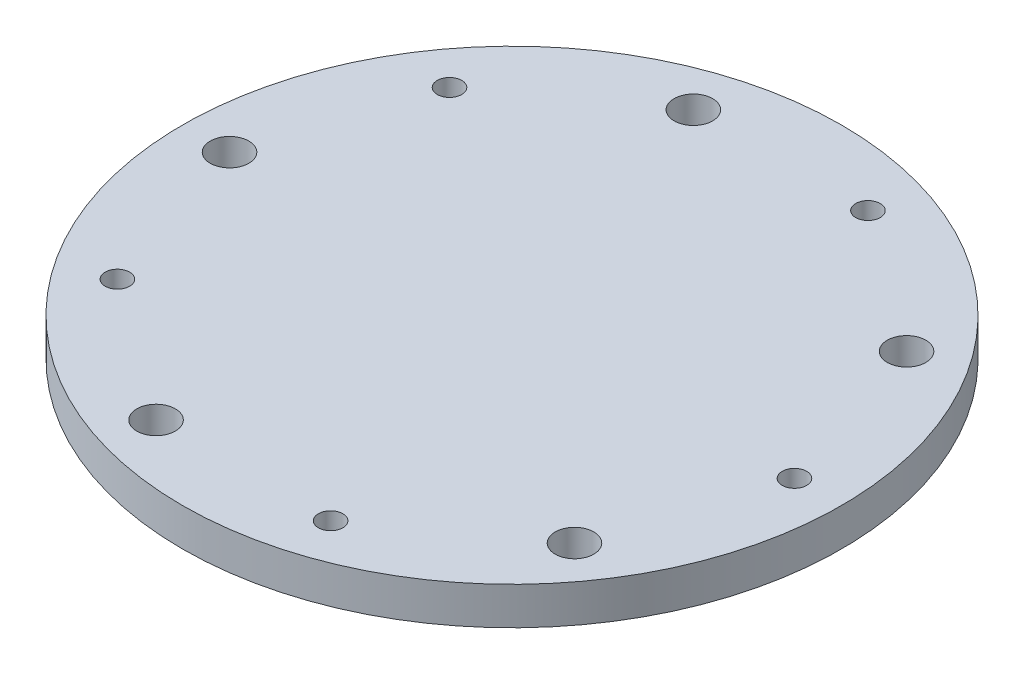
ISO-10303-21;
HEADER;
FILE_DESCRIPTION(('STEP AP214'),'2;1');
FILE_NAME('part.step','',(''),(''),'','','');
FILE_SCHEMA(('AUTOMOTIVE_DESIGN { 1 0 10303 214 1 1 1 1 }'));
ENDSEC;
DATA;
#1=APPLICATION_CONTEXT('core data for automotive mechanical design processes');
#2=APPLICATION_PROTOCOL_DEFINITION('international standard','automotive_design',2000,#1);
#3=PRODUCT_CONTEXT('',#1,'mechanical');
#4=PRODUCT('Part','Part','',(#3));
#5=PRODUCT_RELATED_PRODUCT_CATEGORY('part','',(#4));
#6=PRODUCT_DEFINITION_FORMATION('','',#4);
#7=PRODUCT_DEFINITION_CONTEXT('part definition',#1,'design');
#8=PRODUCT_DEFINITION('design','',#6,#7);
#9=PRODUCT_DEFINITION_SHAPE('','',#8);
#10=(LENGTH_UNIT() NAMED_UNIT(*) SI_UNIT(.MILLI.,.METRE.));
#11=(NAMED_UNIT(*) PLANE_ANGLE_UNIT() SI_UNIT($,.RADIAN.));
#12=(NAMED_UNIT(*) SI_UNIT($,.STERADIAN.) SOLID_ANGLE_UNIT());
#13=UNCERTAINTY_MEASURE_WITH_UNIT(LENGTH_MEASURE(1.E-05),#10,'distance_accuracy_value','');
#14=(GEOMETRIC_REPRESENTATION_CONTEXT(3) GLOBAL_UNCERTAINTY_ASSIGNED_CONTEXT((#13)) GLOBAL_UNIT_ASSIGNED_CONTEXT((#10,
#11,#12)) REPRESENTATION_CONTEXT('',''));
#15=CARTESIAN_POINT('',(0.,0.,0.));
#16=DIRECTION('',(0.,0.,1.));
#17=DIRECTION('',(1.,0.,0.));
#18=AXIS2_PLACEMENT_3D('',#15,#16,#17);
#19=CARTESIAN_POINT('',(-47.4,0.,0.));
#20=DIRECTION('',(0.,-1.,0.));
#21=DIRECTION('',(1.,0.,0.));
#22=AXIS2_PLACEMENT_3D('',#19,#20,#21);
#23=PLANE('',#22);
#24=CARTESIAN_POINT('',(-48.5410196624966,0.,35.2671151375488));
#25=DIRECTION('',(0.,-1.,0.));
#26=DIRECTION('',(0.309016994374945,0.,-0.951056516295155));
#27=AXIS2_PLACEMENT_3D('',#24,#25,#26);
#28=CIRCLE('',#27,2.6);
#29=CARTESIAN_POINT('',(-47.7375754771217,0.,32.7943681951814));
#30=VERTEX_POINT('',#29);
#31=EDGE_CURVE('E139',#30,#30,#28,.F.);
#32=ORIENTED_EDGE('',*,*,#31,.F.);
#33=EDGE_LOOP('',(#32));
#34=FACE_BOUND('',#33,.T.);
#35=CARTESIAN_POINT('',(18.5410196624975,0.,57.063390977709));
#36=DIRECTION('',(0.,-1.,0.));
#37=DIRECTION('',(-0.809016994374951,0.,-0.587785252292469));
#38=AXIS2_PLACEMENT_3D('',#35,#36,#37);
#39=CIRCLE('',#38,2.6);
#40=CARTESIAN_POINT('',(16.4375754771226,0.,55.5351493217486));
#41=VERTEX_POINT('',#40);
#42=EDGE_CURVE('E149',#41,#41,#39,.F.);
#43=ORIENTED_EDGE('',*,*,#42,.F.);
#44=EDGE_LOOP('',(#43));
#45=FACE_BOUND('',#44,.T.);
#46=CARTESIAN_POINT('',(60.,0.,-8.67361737988404E-13));
#47=DIRECTION('',(0.,-1.,0.));
#48=DIRECTION('',(-0.809016994374942,0.,0.58778525229248));
#49=AXIS2_PLACEMENT_3D('',#46,#47,#48);
#50=CIRCLE('',#49,2.6);
#51=CARTESIAN_POINT('',(57.8965558146252,0.,1.52824165595958));
#52=VERTEX_POINT('',#51);
#53=EDGE_CURVE('E158',#52,#52,#50,.F.);
#54=ORIENTED_EDGE('',*,*,#53,.F.);
#55=EDGE_LOOP('',(#54));
#56=FACE_BOUND('',#55,.T.);
#57=CARTESIAN_POINT('',(18.5410196624959,0.,-57.0633909777095));
#58=DIRECTION('',(0.,-1.,0.));
#59=DIRECTION('',(0.309016994374958,0.,0.95105651629515));
#60=AXIS2_PLACEMENT_3D('',#57,#58,#59);
#61=CIRCLE('',#60,2.6);
#62=CARTESIAN_POINT('',(19.3444638478708,0.,-54.5906440353421));
#63=VERTEX_POINT('',#62);
#64=EDGE_CURVE('E167',#63,#63,#61,.F.);
#65=ORIENTED_EDGE('',*,*,#64,.F.);
#66=EDGE_LOOP('',(#65));
#67=FACE_BOUND('',#66,.T.);
#68=CARTESIAN_POINT('',(-18.5410196624967,0.,57.0633909777093));
#69=DIRECTION('',(0.,-1.,0.));
#70=DIRECTION('',(0.309016994374945,0.,-0.951056516295155));
#71=AXIS2_PLACEMENT_3D('',#68,#69,#70);
#72=CIRCLE('',#71,4.1);
#73=CARTESIAN_POINT('',(-17.2740499855594,0.,53.1640592608991));
#74=VERTEX_POINT('',#73);
#75=EDGE_CURVE('E100',#74,#74,#72,.F.);
#76=ORIENTED_EDGE('',*,*,#75,.F.);
#77=EDGE_LOOP('',(#76));
#78=FACE_BOUND('',#77,.T.);
#79=CARTESIAN_POINT('',(48.541019662497,0.,35.2671151375481));
#80=DIRECTION('',(0.,-1.,0.));
#81=DIRECTION('',(-0.809016994374951,0.,-0.587785252292469));
#82=AXIS2_PLACEMENT_3D('',#79,#80,#81);
#83=CIRCLE('',#82,4.1);
#84=CARTESIAN_POINT('',(45.2240499855597,0.,32.857195603149));
#85=VERTEX_POINT('',#84);
#86=EDGE_CURVE('E111',#85,#85,#83,.F.);
#87=ORIENTED_EDGE('',*,*,#86,.F.);
#88=EDGE_LOOP('',(#87));
#89=FACE_BOUND('',#88,.T.);
#90=CARTESIAN_POINT('',(48.5410196624965,0.,-35.2671151375488));
#91=DIRECTION('',(0.,-1.,0.));
#92=DIRECTION('',(-0.809016994374942,0.,0.58778525229248));
#93=AXIS2_PLACEMENT_3D('',#90,#91,#92);
#94=CIRCLE('',#93,4.1);
#95=CARTESIAN_POINT('',(45.2240499855593,0.,-32.8571956031496));
#96=VERTEX_POINT('',#95);
#97=EDGE_CURVE('E122',#96,#96,#94,.F.);
#98=ORIENTED_EDGE('',*,*,#97,.F.);
#99=EDGE_LOOP('',(#98));
#100=FACE_BOUND('',#99,.T.);
#101=CARTESIAN_POINT('',(-18.5410196624975,0.,-57.063390977709));
#102=DIRECTION('',(0.,-1.,0.));
#103=DIRECTION('',(0.309016994374958,0.,0.95105651629515));
#104=AXIS2_PLACEMENT_3D('',#101,#102,#103);
#105=CIRCLE('',#104,4.1);
#106=CARTESIAN_POINT('',(-17.2740499855602,0.,-53.1640592608989));
#107=VERTEX_POINT('',#106);
#108=EDGE_CURVE('E129',#107,#107,#105,.F.);
#109=ORIENTED_EDGE('',*,*,#108,.F.);
#110=EDGE_LOOP('',(#109));
#111=FACE_BOUND('',#110,.T.);
#112=CARTESIAN_POINT('',(-60.,0.,0.));
#113=DIRECTION('',(0.,-1.,0.));
#114=DIRECTION('',(1.,0.,0.));
#115=AXIS2_PLACEMENT_3D('',#112,#113,#114);
#116=CIRCLE('',#115,4.1);
#117=CARTESIAN_POINT('',(-55.9,0.,0.));
#118=VERTEX_POINT('',#117);
#119=EDGE_CURVE('E60',#118,#118,#116,.F.);
#120=ORIENTED_EDGE('',*,*,#119,.F.);
#121=EDGE_LOOP('',(#120));
#122=FACE_BOUND('',#121,.T.);
#123=CARTESIAN_POINT('',(-48.541019662497,0.,-35.2671151375481));
#124=DIRECTION('',(0.,-1.,0.));
#125=DIRECTION('',(1.,0.,0.));
#126=AXIS2_PLACEMENT_3D('',#123,#124,#125);
#127=CIRCLE('',#126,2.6);
#128=CARTESIAN_POINT('',(-45.941019662497,0.,-35.2671151375481));
#129=VERTEX_POINT('',#128);
#130=EDGE_CURVE('E68',#129,#129,#127,.F.);
#131=ORIENTED_EDGE('',*,*,#130,.F.);
#132=EDGE_LOOP('',(#131));
#133=FACE_BOUND('',#132,.T.);
#134=CARTESIAN_POINT('',(0.,0.,0.));
#135=DIRECTION('',(0.,-1.,0.));
#136=DIRECTION('',(0.,0.,-1.));
#137=AXIS2_PLACEMENT_3D('',#134,#135,#136);
#138=CIRCLE('',#137,70.);
#139=CARTESIAN_POINT('',(0.,0.,-70.));
#140=VERTEX_POINT('',#139);
#141=EDGE_CURVE('E11',#140,#140,#138,.T.);
#142=ORIENTED_EDGE('',*,*,#141,.F.);
#143=EDGE_LOOP('',(#142));
#144=FACE_BOUND('',#143,.T.);
#145=ADVANCED_FACE('F47',(#34,#45,#56,#67,#78,#89,#100,#111,#122,#133,#144),#23,.F.);
#146=CARTESIAN_POINT('',(0.,0.,0.));
#147=DIRECTION('',(0.,-1.,0.));
#148=DIRECTION('',(0.,0.,-1.));
#149=AXIS2_PLACEMENT_3D('',#146,#147,#148);
#150=CYLINDRICAL_SURFACE('',#149,70.);
#151=ORIENTED_EDGE('',*,*,#141,.T.);
#152=EDGE_LOOP('',(#151));
#153=FACE_BOUND('',#152,.T.);
#154=CARTESIAN_POINT('',(0.,-8.,0.));
#155=DIRECTION('',(0.,-1.,0.));
#156=DIRECTION('',(0.,0.,-1.));
#157=AXIS2_PLACEMENT_3D('',#154,#155,#156);
#158=CIRCLE('',#157,70.);
#159=CARTESIAN_POINT('',(0.,-8.,-70.));
#160=VERTEX_POINT('',#159);
#161=EDGE_CURVE('E50',#160,#160,#158,.T.);
#162=ORIENTED_EDGE('',*,*,#161,.F.);
#163=EDGE_LOOP('',(#162));
#164=FACE_BOUND('',#163,.T.);
#165=ADVANCED_FACE('F90',(#153,#164),#150,.T.);
#166=CARTESIAN_POINT('',(-7.,-8.,0.));
#167=DIRECTION('',(0.,1.,0.));
#168=DIRECTION('',(-1.,0.,0.));
#169=AXIS2_PLACEMENT_3D('',#166,#167,#168);
#170=PLANE('',#169);
#171=CARTESIAN_POINT('',(-48.5410196624966,-8.,35.2671151375488));
#172=DIRECTION('',(0.,-1.,0.));
#173=DIRECTION('',(-0.951056516295155,0.,-0.309016994374945));
#174=AXIS2_PLACEMENT_3D('',#171,#172,#173);
#175=CIRCLE('',#174,2.6);
#176=CARTESIAN_POINT('',(-51.013766604864,-8.,34.463670952174));
#177=VERTEX_POINT('',#176);
#178=EDGE_CURVE('E132',#177,#177,#175,.T.);
#179=ORIENTED_EDGE('',*,*,#178,.F.);
#180=EDGE_LOOP('',(#179));
#181=FACE_BOUND('',#180,.T.);
#182=CARTESIAN_POINT('',(18.5410196624975,-8.,57.063390977709));
#183=DIRECTION('',(0.,-1.,0.));
#184=DIRECTION('',(-0.587785252292469,0.,0.809016994374951));
#185=AXIS2_PLACEMENT_3D('',#182,#183,#184);
#186=CIRCLE('',#185,2.6);
#187=CARTESIAN_POINT('',(17.0127780065371,-8.,59.1668351630839));
#188=VERTEX_POINT('',#187);
#189=EDGE_CURVE('E145',#188,#188,#186,.T.);
#190=ORIENTED_EDGE('',*,*,#189,.F.);
#191=EDGE_LOOP('',(#190));
#192=FACE_BOUND('',#191,.T.);
#193=CARTESIAN_POINT('',(60.,-8.,-8.67361737988404E-13));
#194=DIRECTION('',(0.,-1.,0.));
#195=DIRECTION('',(0.58778525229248,0.,0.809016994374942));
#196=AXIS2_PLACEMENT_3D('',#193,#194,#195);
#197=CIRCLE('',#196,2.6);
#198=CARTESIAN_POINT('',(61.5282416559604,-8.,2.10344418537398));
#199=VERTEX_POINT('',#198);
#200=EDGE_CURVE('E161',#199,#199,#197,.T.);
#201=ORIENTED_EDGE('',*,*,#200,.F.);
#202=EDGE_LOOP('',(#201));
#203=FACE_BOUND('',#202,.T.);
#204=CARTESIAN_POINT('',(18.5410196624959,-8.,-57.0633909777095));
#205=DIRECTION('',(0.,-1.,0.));
#206=DIRECTION('',(0.95105651629515,0.,-0.309016994374958));
#207=AXIS2_PLACEMENT_3D('',#204,#205,#206);
#208=CIRCLE('',#207,2.6);
#209=CARTESIAN_POINT('',(21.0137666048633,-8.,-57.8668351630844));
#210=VERTEX_POINT('',#209);
#211=EDGE_CURVE('E162',#210,#210,#208,.T.);
#212=ORIENTED_EDGE('',*,*,#211,.F.);
#213=EDGE_LOOP('',(#212));
#214=FACE_BOUND('',#213,.T.);
#215=CARTESIAN_POINT('',(-18.5410196624967,-8.,57.0633909777093));
#216=DIRECTION('',(0.,-1.,0.));
#217=DIRECTION('',(-0.951056516295155,0.,-0.309016994374945));
#218=AXIS2_PLACEMENT_3D('',#215,#216,#217);
#219=CIRCLE('',#218,4.1);
#220=CARTESIAN_POINT('',(-22.4403513793068,-8.,55.796421300772));
#221=VERTEX_POINT('',#220);
#222=EDGE_CURVE('E97',#221,#221,#219,.T.);
#223=ORIENTED_EDGE('',*,*,#222,.F.);
#224=EDGE_LOOP('',(#223));
#225=FACE_BOUND('',#224,.T.);
#226=CARTESIAN_POINT('',(48.541019662497,-8.,35.2671151375481));
#227=DIRECTION('',(0.,-1.,0.));
#228=DIRECTION('',(-0.587785252292469,0.,0.809016994374951));
#229=AXIS2_PLACEMENT_3D('',#226,#227,#228);
#230=CIRCLE('',#229,4.1);
#231=CARTESIAN_POINT('',(46.1311001280979,-8.,38.5840848144854));
#232=VERTEX_POINT('',#231);
#233=EDGE_CURVE('E106',#232,#232,#230,.T.);
#234=ORIENTED_EDGE('',*,*,#233,.F.);
#235=EDGE_LOOP('',(#234));
#236=FACE_BOUND('',#235,.T.);
#237=CARTESIAN_POINT('',(48.5410196624965,-8.,-35.2671151375488));
#238=DIRECTION('',(0.,-1.,0.));
#239=DIRECTION('',(0.58778525229248,0.,0.809016994374942));
#240=AXIS2_PLACEMENT_3D('',#237,#238,#239);
#241=CIRCLE('',#240,4.1);
#242=CARTESIAN_POINT('',(50.9509391968957,-8.,-31.9501454606115));
#243=VERTEX_POINT('',#242);
#244=EDGE_CURVE('E125',#243,#243,#241,.T.);
#245=ORIENTED_EDGE('',*,*,#244,.F.);
#246=EDGE_LOOP('',(#245));
#247=FACE_BOUND('',#246,.T.);
#248=CARTESIAN_POINT('',(-18.5410196624975,-8.,-57.063390977709));
#249=DIRECTION('',(0.,-1.,0.));
#250=DIRECTION('',(0.95105651629515,0.,-0.309016994374958));
#251=AXIS2_PLACEMENT_3D('',#248,#249,#250);
#252=CIRCLE('',#251,4.1);
#253=CARTESIAN_POINT('',(-14.6416879456874,-8.,-58.3303606546463));
#254=VERTEX_POINT('',#253);
#255=EDGE_CURVE('E78',#254,#254,#252,.T.);
#256=ORIENTED_EDGE('',*,*,#255,.F.);
#257=EDGE_LOOP('',(#256));
#258=FACE_BOUND('',#257,.T.);
#259=CARTESIAN_POINT('',(-60.,-8.,0.));
#260=DIRECTION('',(0.,-1.,0.));
#261=DIRECTION('',(0.,0.,-1.));
#262=AXIS2_PLACEMENT_3D('',#259,#260,#261);
#263=CIRCLE('',#262,4.1);
#264=CARTESIAN_POINT('',(-60.,-8.,-4.1));
#265=VERTEX_POINT('',#264);
#266=EDGE_CURVE('E67',#265,#265,#263,.T.);
#267=ORIENTED_EDGE('',*,*,#266,.F.);
#268=EDGE_LOOP('',(#267));
#269=FACE_BOUND('',#268,.T.);
#270=CARTESIAN_POINT('',(-48.541019662497,-8.,-35.2671151375481));
#271=DIRECTION('',(0.,-1.,0.));
#272=DIRECTION('',(0.,0.,-1.));
#273=AXIS2_PLACEMENT_3D('',#270,#271,#272);
#274=CIRCLE('',#273,2.6);
#275=CARTESIAN_POINT('',(-48.541019662497,-8.,-37.8671151375481));
#276=VERTEX_POINT('',#275);
#277=EDGE_CURVE('E62',#276,#276,#274,.T.);
#278=ORIENTED_EDGE('',*,*,#277,.F.);
#279=EDGE_LOOP('',(#278));
#280=FACE_BOUND('',#279,.T.);
#281=ORIENTED_EDGE('',*,*,#161,.T.);
#282=EDGE_LOOP('',(#281));
#283=FACE_BOUND('',#282,.T.);
#284=ADVANCED_FACE('F177',(#181,#192,#203,#214,#225,#236,#247,#258,#269,#280,#283),#170,.F.);
#285=CARTESIAN_POINT('',(-48.541019662497,11.5965512114594,-35.2671151375481));
#286=DIRECTION('',(0.,-1.,0.));
#287=DIRECTION('',(0.,0.,-1.));
#288=AXIS2_PLACEMENT_3D('',#285,#286,#287);
#289=CYLINDRICAL_SURFACE('',#288,2.6);
#290=ORIENTED_EDGE('',*,*,#130,.T.);
#291=EDGE_LOOP('',(#290));
#292=FACE_BOUND('',#291,.T.);
#293=ORIENTED_EDGE('',*,*,#277,.T.);
#294=EDGE_LOOP('',(#293));
#295=FACE_BOUND('',#294,.T.);
#296=ADVANCED_FACE('F180',(#292,#295),#289,.F.);
#297=CARTESIAN_POINT('',(-60.,11.5965512114594,0.));
#298=DIRECTION('',(0.,-1.,0.));
#299=DIRECTION('',(0.,0.,-1.));
#300=AXIS2_PLACEMENT_3D('',#297,#298,#299);
#301=CYLINDRICAL_SURFACE('',#300,4.1);
#302=ORIENTED_EDGE('',*,*,#119,.T.);
#303=EDGE_LOOP('',(#302));
#304=FACE_BOUND('',#303,.T.);
#305=ORIENTED_EDGE('',*,*,#266,.T.);
#306=EDGE_LOOP('',(#305));
#307=FACE_BOUND('',#306,.T.);
#308=ADVANCED_FACE('F85',(#304,#307),#301,.F.);
#309=CARTESIAN_POINT('',(-18.5410196624975,11.5965512114594,-57.063390977709));
#310=DIRECTION('',(0.,-1.,0.));
#311=DIRECTION('',(0.95105651629515,0.,-0.309016994374958));
#312=AXIS2_PLACEMENT_3D('',#309,#310,#311);
#313=CYLINDRICAL_SURFACE('',#312,4.1);
#314=ORIENTED_EDGE('',*,*,#108,.T.);
#315=EDGE_LOOP('',(#314));
#316=FACE_BOUND('',#315,.T.);
#317=ORIENTED_EDGE('',*,*,#255,.T.);
#318=EDGE_LOOP('',(#317));
#319=FACE_BOUND('',#318,.T.);
#320=ADVANCED_FACE('F204',(#316,#319),#313,.F.);
#321=CARTESIAN_POINT('',(48.5410196624965,11.5965512114594,-35.2671151375488));
#322=DIRECTION('',(0.,-1.,0.));
#323=DIRECTION('',(0.58778525229248,0.,0.809016994374942));
#324=AXIS2_PLACEMENT_3D('',#321,#322,#323);
#325=CYLINDRICAL_SURFACE('',#324,4.1);
#326=ORIENTED_EDGE('',*,*,#97,.T.);
#327=EDGE_LOOP('',(#326));
#328=FACE_BOUND('',#327,.T.);
#329=ORIENTED_EDGE('',*,*,#244,.T.);
#330=EDGE_LOOP('',(#329));
#331=FACE_BOUND('',#330,.T.);
#332=ADVANCED_FACE('F207',(#328,#331),#325,.F.);
#333=CARTESIAN_POINT('',(48.541019662497,11.5965512114594,35.2671151375481));
#334=DIRECTION('',(0.,-1.,0.));
#335=DIRECTION('',(-0.587785252292469,0.,0.809016994374951));
#336=AXIS2_PLACEMENT_3D('',#333,#334,#335);
#337=CYLINDRICAL_SURFACE('',#336,4.1);
#338=ORIENTED_EDGE('',*,*,#86,.T.);
#339=EDGE_LOOP('',(#338));
#340=FACE_BOUND('',#339,.T.);
#341=ORIENTED_EDGE('',*,*,#233,.T.);
#342=EDGE_LOOP('',(#341));
#343=FACE_BOUND('',#342,.T.);
#344=ADVANCED_FACE('F210',(#340,#343),#337,.F.);
#345=CARTESIAN_POINT('',(-18.5410196624967,11.5965512114594,57.0633909777093));
#346=DIRECTION('',(0.,-1.,0.));
#347=DIRECTION('',(-0.951056516295155,0.,-0.309016994374945));
#348=AXIS2_PLACEMENT_3D('',#345,#346,#347);
#349=CYLINDRICAL_SURFACE('',#348,4.1);
#350=ORIENTED_EDGE('',*,*,#75,.T.);
#351=EDGE_LOOP('',(#350));
#352=FACE_BOUND('',#351,.T.);
#353=ORIENTED_EDGE('',*,*,#222,.T.);
#354=EDGE_LOOP('',(#353));
#355=FACE_BOUND('',#354,.T.);
#356=ADVANCED_FACE('F214',(#352,#355),#349,.F.);
#357=CARTESIAN_POINT('',(18.5410196624959,11.5965512114594,-57.0633909777095));
#358=DIRECTION('',(0.,-1.,0.));
#359=DIRECTION('',(0.95105651629515,0.,-0.309016994374958));
#360=AXIS2_PLACEMENT_3D('',#357,#358,#359);
#361=CYLINDRICAL_SURFACE('',#360,2.6);
#362=ORIENTED_EDGE('',*,*,#64,.T.);
#363=EDGE_LOOP('',(#362));
#364=FACE_BOUND('',#363,.T.);
#365=ORIENTED_EDGE('',*,*,#211,.T.);
#366=EDGE_LOOP('',(#365));
#367=FACE_BOUND('',#366,.T.);
#368=ADVANCED_FACE('F175',(#364,#367),#361,.F.);
#369=CARTESIAN_POINT('',(60.,11.5965512114594,-8.67361737988404E-13));
#370=DIRECTION('',(0.,-1.,0.));
#371=DIRECTION('',(0.58778525229248,0.,0.809016994374942));
#372=AXIS2_PLACEMENT_3D('',#369,#370,#371);
#373=CYLINDRICAL_SURFACE('',#372,2.6);
#374=ORIENTED_EDGE('',*,*,#53,.T.);
#375=EDGE_LOOP('',(#374));
#376=FACE_BOUND('',#375,.T.);
#377=ORIENTED_EDGE('',*,*,#200,.T.);
#378=EDGE_LOOP('',(#377));
#379=FACE_BOUND('',#378,.T.);
#380=ADVANCED_FACE('F221',(#376,#379),#373,.F.);
#381=CARTESIAN_POINT('',(18.5410196624975,11.5965512114594,57.063390977709));
#382=DIRECTION('',(0.,-1.,0.));
#383=DIRECTION('',(-0.587785252292469,0.,0.809016994374951));
#384=AXIS2_PLACEMENT_3D('',#381,#382,#383);
#385=CYLINDRICAL_SURFACE('',#384,2.6);
#386=ORIENTED_EDGE('',*,*,#42,.T.);
#387=EDGE_LOOP('',(#386));
#388=FACE_BOUND('',#387,.T.);
#389=ORIENTED_EDGE('',*,*,#189,.T.);
#390=EDGE_LOOP('',(#389));
#391=FACE_BOUND('',#390,.T.);
#392=ADVANCED_FACE('F225',(#388,#391),#385,.F.);
#393=CARTESIAN_POINT('',(-48.5410196624966,11.5965512114594,35.2671151375488));
#394=DIRECTION('',(0.,-1.,0.));
#395=DIRECTION('',(-0.951056516295155,0.,-0.309016994374945));
#396=AXIS2_PLACEMENT_3D('',#393,#394,#395);
#397=CYLINDRICAL_SURFACE('',#396,2.6);
#398=ORIENTED_EDGE('',*,*,#31,.T.);
#399=EDGE_LOOP('',(#398));
#400=FACE_BOUND('',#399,.T.);
#401=ORIENTED_EDGE('',*,*,#178,.T.);
#402=EDGE_LOOP('',(#401));
#403=FACE_BOUND('',#402,.T.);
#404=ADVANCED_FACE('F229',(#400,#403),#397,.F.);
#405=CLOSED_SHELL('',(#145,#165,#284,#296,#308,#320,#332,#344,#356,#368,#380,#392,#404));
#406=MANIFOLD_SOLID_BREP('B2',#405);
#407=ADVANCED_BREP_SHAPE_REPRESENTATION('',(#18,#406),#14);
#408=SHAPE_DEFINITION_REPRESENTATION(#9,#407);
ENDSEC;
END-ISO-10303-21;
